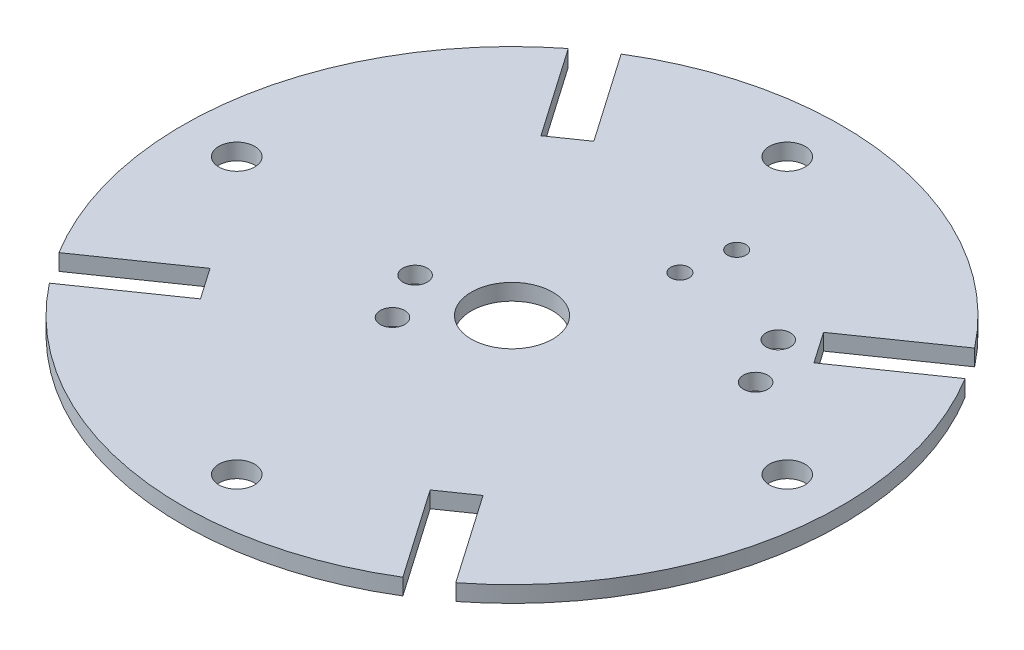
ISO-10303-21;
HEADER;
FILE_DESCRIPTION(('STEP AP214'),'2;1');
FILE_NAME('part.step','',(''),(''),'','','');
FILE_SCHEMA(('AUTOMOTIVE_DESIGN { 1 0 10303 214 1 1 1 1 }'));
ENDSEC;
DATA;
#1=APPLICATION_CONTEXT('core data for automotive mechanical design processes');
#2=APPLICATION_PROTOCOL_DEFINITION('international standard','automotive_design',2000,#1);
#3=PRODUCT_CONTEXT('',#1,'mechanical');
#4=PRODUCT('Part','Part','',(#3));
#5=PRODUCT_RELATED_PRODUCT_CATEGORY('part','',(#4));
#6=PRODUCT_DEFINITION_FORMATION('','',#4);
#7=PRODUCT_DEFINITION_CONTEXT('part definition',#1,'design');
#8=PRODUCT_DEFINITION('design','',#6,#7);
#9=PRODUCT_DEFINITION_SHAPE('','',#8);
#10=(LENGTH_UNIT() NAMED_UNIT(*) SI_UNIT(.MILLI.,.METRE.));
#11=(NAMED_UNIT(*) PLANE_ANGLE_UNIT() SI_UNIT($,.RADIAN.));
#12=(NAMED_UNIT(*) SI_UNIT($,.STERADIAN.) SOLID_ANGLE_UNIT());
#13=UNCERTAINTY_MEASURE_WITH_UNIT(LENGTH_MEASURE(1.E-05),#10,'distance_accuracy_value','');
#14=(GEOMETRIC_REPRESENTATION_CONTEXT(3) GLOBAL_UNCERTAINTY_ASSIGNED_CONTEXT((#13)) GLOBAL_UNIT_ASSIGNED_CONTEXT((#10,
#11,#12)) REPRESENTATION_CONTEXT('',''));
#15=CARTESIAN_POINT('',(0.,0.,0.));
#16=DIRECTION('',(0.,0.,1.));
#17=DIRECTION('',(1.,0.,0.));
#18=AXIS2_PLACEMENT_3D('',#15,#16,#17);
#19=CARTESIAN_POINT('',(0.,1.5,0.));
#20=DIRECTION('',(0.,-1.,0.));
#21=DIRECTION('',(0.,0.,-1.));
#22=AXIS2_PLACEMENT_3D('',#19,#20,#21);
#23=CYLINDRICAL_SURFACE('',#22,60.7);
#24=CARTESIAN_POINT('',(0.,-1.5,0.));
#25=DIRECTION('',(0.,1.,0.));
#26=DIRECTION('',(0.,0.,1.));
#27=AXIS2_PLACEMENT_3D('',#24,#25,#26);
#28=CIRCLE('',#27,60.7);
#29=CARTESIAN_POINT('',(37.4279786936085,-1.5,47.7874084975403));
#30=VERTEX_POINT('',#29);
#31=CARTESIAN_POINT('',(51.7787065197054,-1.5,-31.6773665437363));
#32=VERTEX_POINT('',#31);
#33=EDGE_CURVE('E45',#30,#32,#28,.T.);
#34=ORIENTED_EDGE('',*,*,#33,.T.);
#35=DIRECTION('',(0.,1.,0.));
#36=VECTOR('',#35,1.);
#37=CARTESIAN_POINT('',(51.7787065197054,-1.5,-31.6773665437363));
#38=LINE('',#37,#36);
#39=CARTESIAN_POINT('',(51.7787065197054,1.5,-31.6773665437363));
#40=VERTEX_POINT('',#39);
#41=EDGE_CURVE('E186',#32,#40,#38,.T.);
#42=ORIENTED_EDGE('',*,*,#41,.T.);
#43=CARTESIAN_POINT('',(0.,1.5,0.));
#44=DIRECTION('',(0.,1.,0.));
#45=DIRECTION('',(0.,0.,1.));
#46=AXIS2_PLACEMENT_3D('',#43,#44,#45);
#47=CIRCLE('',#46,60.7);
#48=CARTESIAN_POINT('',(37.4279786936085,1.5,47.7874084975403));
#49=VERTEX_POINT('',#48);
#50=EDGE_CURVE('E11',#49,#40,#47,.T.);
#51=ORIENTED_EDGE('',*,*,#50,.F.);
#52=DIRECTION('',(0.,1.,0.));
#53=VECTOR('',#52,1.);
#54=CARTESIAN_POINT('',(37.4279786936085,-1.5,47.7874084975403));
#55=LINE('',#54,#53);
#56=EDGE_CURVE('E252',#30,#49,#55,.T.);
#57=ORIENTED_EDGE('',*,*,#56,.F.);
#58=EDGE_LOOP('',(#34,#42,#51,#57));
#59=FACE_BOUND('',#58,.T.);
#60=ADVANCED_FACE('F41',(#59),#23,.T.);
#61=CARTESIAN_POINT('',(47.7874084975402,1.5,-37.4279786936087));
#62=VERTEX_POINT('',#61);
#63=CARTESIAN_POINT('',(-31.6773665437361,1.5,-51.7787065197055));
#64=VERTEX_POINT('',#63);
#65=EDGE_CURVE('E50',#62,#64,#47,.T.);
#66=ORIENTED_EDGE('',*,*,#65,.F.);
#67=DIRECTION('',(0.,1.,0.));
#68=VECTOR('',#67,1.);
#69=CARTESIAN_POINT('',(47.7874084975402,-1.5,-37.4279786936087));
#70=LINE('',#69,#68);
#71=CARTESIAN_POINT('',(47.7874084975402,-1.5,-37.4279786936087));
#72=VERTEX_POINT('',#71);
#73=EDGE_CURVE('E162',#72,#62,#70,.T.);
#74=ORIENTED_EDGE('',*,*,#73,.F.);
#75=CARTESIAN_POINT('',(-31.6773665437361,-1.5,-51.7787065197055));
#76=VERTEX_POINT('',#75);
#77=EDGE_CURVE('E330',#72,#76,#28,.T.);
#78=ORIENTED_EDGE('',*,*,#77,.T.);
#79=DIRECTION('',(0.,1.,0.));
#80=VECTOR('',#79,1.);
#81=CARTESIAN_POINT('',(-31.6773665437361,-1.5,-51.7787065197055));
#82=LINE('',#81,#80);
#83=EDGE_CURVE('E211',#76,#64,#82,.T.);
#84=ORIENTED_EDGE('',*,*,#83,.T.);
#85=EDGE_LOOP('',(#66,#74,#78,#84));
#86=FACE_BOUND('',#85,.T.);
#87=ADVANCED_FACE('F339',(#86),#23,.T.);
#88=CARTESIAN_POINT('',(-37.4279786936085,1.5,-47.7874084975403));
#89=VERTEX_POINT('',#88);
#90=CARTESIAN_POINT('',(-51.7787065197051,1.5,31.6773665437366));
#91=VERTEX_POINT('',#90);
#92=EDGE_CURVE('E335',#89,#91,#47,.T.);
#93=ORIENTED_EDGE('',*,*,#92,.F.);
#94=DIRECTION('',(0.,1.,0.));
#95=VECTOR('',#94,1.);
#96=CARTESIAN_POINT('',(-37.4279786936085,-1.5,-47.7874084975403));
#97=LINE('',#96,#95);
#98=CARTESIAN_POINT('',(-37.4279786936085,-1.5,-47.7874084975403));
#99=VERTEX_POINT('',#98);
#100=EDGE_CURVE('E201',#99,#89,#97,.T.);
#101=ORIENTED_EDGE('',*,*,#100,.F.);
#102=CARTESIAN_POINT('',(-51.7787065197051,-1.5,31.6773665437366));
#103=VERTEX_POINT('',#102);
#104=EDGE_CURVE('E324',#99,#103,#28,.T.);
#105=ORIENTED_EDGE('',*,*,#104,.T.);
#106=DIRECTION('',(0.,1.,0.));
#107=VECTOR('',#106,1.);
#108=CARTESIAN_POINT('',(-51.7787065197051,-1.5,31.6773665437366));
#109=LINE('',#108,#107);
#110=EDGE_CURVE('E237',#103,#91,#109,.T.);
#111=ORIENTED_EDGE('',*,*,#110,.T.);
#112=EDGE_LOOP('',(#93,#101,#105,#111));
#113=FACE_BOUND('',#112,.T.);
#114=ADVANCED_FACE('F354',(#113),#23,.T.);
#115=CARTESIAN_POINT('',(-47.7874084975399,1.5,37.427978693609));
#116=VERTEX_POINT('',#115);
#117=CARTESIAN_POINT('',(31.6773665437361,1.5,51.7787065197055));
#118=VERTEX_POINT('',#117);
#119=EDGE_CURVE('E51',#116,#118,#47,.T.);
#120=ORIENTED_EDGE('',*,*,#119,.F.);
#121=DIRECTION('',(0.,1.,0.));
#122=VECTOR('',#121,1.);
#123=CARTESIAN_POINT('',(-47.7874084975399,-1.5,37.427978693609));
#124=LINE('',#123,#122);
#125=CARTESIAN_POINT('',(-47.7874084975399,-1.5,37.427978693609));
#126=VERTEX_POINT('',#125);
#127=EDGE_CURVE('E225',#126,#116,#124,.T.);
#128=ORIENTED_EDGE('',*,*,#127,.F.);
#129=CARTESIAN_POINT('',(31.6773665437361,-1.5,51.7787065197055));
#130=VERTEX_POINT('',#129);
#131=EDGE_CURVE('E321',#126,#130,#28,.T.);
#132=ORIENTED_EDGE('',*,*,#131,.T.);
#133=DIRECTION('',(0.,1.,0.));
#134=VECTOR('',#133,1.);
#135=CARTESIAN_POINT('',(31.6773665437361,-1.5,51.7787065197055));
#136=LINE('',#135,#134);
#137=EDGE_CURVE('E260',#130,#118,#136,.T.);
#138=ORIENTED_EDGE('',*,*,#137,.T.);
#139=EDGE_LOOP('',(#120,#128,#132,#138));
#140=FACE_BOUND('',#139,.T.);
#141=ADVANCED_FACE('F43',(#140),#23,.T.);
#142=CARTESIAN_POINT('',(0.,1.5,0.));
#143=DIRECTION('',(0.,1.,0.));
#144=DIRECTION('',(0.,0.,1.));
#145=AXIS2_PLACEMENT_3D('',#142,#143,#144);
#146=PLANE('',#145);
#147=CARTESIAN_POINT('',(10.2041877460902,1.5,-31.1829208452727));
#148=DIRECTION('',(0.,1.,0.));
#149=DIRECTION('',(0.,0.,1.));
#150=AXIS2_PLACEMENT_3D('',#147,#148,#149);
#151=CIRCLE('',#150,1.69999999999999);
#152=CARTESIAN_POINT('',(10.2041877460902,1.5,-29.4829208452727));
#153=VERTEX_POINT('',#152);
#154=EDGE_CURVE('E716',#153,#153,#151,.T.);
#155=ORIENTED_EDGE('',*,*,#154,.F.);
#156=EDGE_LOOP('',(#155));
#157=FACE_BOUND('',#156,.T.);
#158=CARTESIAN_POINT('',(8.60472966759707,1.5,-22.3261870310981));
#159=DIRECTION('',(0.,1.,0.));
#160=DIRECTION('',(0.,0.,1.));
#161=AXIS2_PLACEMENT_3D('',#158,#159,#160);
#162=CIRCLE('',#161,1.69999999999999);
#163=CARTESIAN_POINT('',(8.60472966759707,1.5,-20.6261870310981));
#164=VERTEX_POINT('',#163);
#165=EDGE_CURVE('E718',#164,#164,#162,.T.);
#166=ORIENTED_EDGE('',*,*,#165,.F.);
#167=EDGE_LOOP('',(#166));
#168=FACE_BOUND('',#167,.T.);
#169=DIRECTION('',(0.821516021410346,0.,-0.570185431737883));
#170=VECTOR('',#169,1.);
#171=CARTESIAN_POINT('',(51.7787065197054,1.5,-31.6773665437363));
#172=LINE('',#171,#170);
#173=CARTESIAN_POINT('',(35.3483860914985,1.5,-20.2736579089786));
#174=VERTEX_POINT('',#173);
#175=EDGE_CURVE('E177',#174,#40,#172,.T.);
#176=ORIENTED_EDGE('',*,*,#175,.F.);
#177=DIRECTION('',(0.570185431737886,0.,0.821516021410344));
#178=VECTOR('',#177,1.);
#179=CARTESIAN_POINT('',(35.3483860914985,1.5,-20.2736579089786));
#180=LINE('',#179,#178);
#181=CARTESIAN_POINT('',(31.3570880693333,1.5,-26.024270058851));
#182=VERTEX_POINT('',#181);
#183=EDGE_CURVE('E170',#182,#174,#180,.T.);
#184=ORIENTED_EDGE('',*,*,#183,.F.);
#185=DIRECTION('',(-0.821516021410345,0.,0.570185431737884));
#186=VECTOR('',#185,1.);
#187=CARTESIAN_POINT('',(31.3570880693333,1.5,-26.024270058851));
#188=LINE('',#187,#186);
#189=EDGE_CURVE('E157',#62,#182,#188,.T.);
#190=ORIENTED_EDGE('',*,*,#189,.F.);
#191=ORIENTED_EDGE('',*,*,#65,.T.);
#192=DIRECTION('',(-0.570185431737881,0.,-0.821516021410348));
#193=VECTOR('',#192,1.);
#194=CARTESIAN_POINT('',(-31.6773665437361,1.5,-51.7787065197055));
#195=LINE('',#194,#193);
#196=CARTESIAN_POINT('',(-20.2736579089785,1.5,-35.3483860914985));
#197=VERTEX_POINT('',#196);
#198=EDGE_CURVE('E209',#197,#64,#195,.T.);
#199=ORIENTED_EDGE('',*,*,#198,.F.);
#200=DIRECTION('',(0.821516021410346,0.,-0.570185431737883));
#201=VECTOR('',#200,1.);
#202=CARTESIAN_POINT('',(-20.2736579089785,1.5,-35.3483860914985));
#203=LINE('',#202,#201);
#204=CARTESIAN_POINT('',(-26.0242700588509,1.5,-31.3570880693334));
#205=VERTEX_POINT('',#204);
#206=EDGE_CURVE('E203',#205,#197,#203,.T.);
#207=ORIENTED_EDGE('',*,*,#206,.F.);
#208=DIRECTION('',(0.570185431737881,0.,0.821516021410347));
#209=VECTOR('',#208,1.);
#210=CARTESIAN_POINT('',(-26.0242700588509,1.5,-31.3570880693334));
#211=LINE('',#210,#209);
#212=EDGE_CURVE('E193',#89,#205,#211,.T.);
#213=ORIENTED_EDGE('',*,*,#212,.F.);
#214=ORIENTED_EDGE('',*,*,#92,.T.);
#215=DIRECTION('',(-0.821516021410342,0.,0.570185431737889));
#216=VECTOR('',#215,1.);
#217=CARTESIAN_POINT('',(-51.7787065197051,1.5,31.6773665437366));
#218=LINE('',#217,#216);
#219=CARTESIAN_POINT('',(-35.3483860914983,1.5,20.2736579089789));
#220=VERTEX_POINT('',#219);
#221=EDGE_CURVE('E235',#220,#91,#218,.T.);
#222=ORIENTED_EDGE('',*,*,#221,.F.);
#223=DIRECTION('',(-0.570185431737891,0.,-0.82151602141034));
#224=VECTOR('',#223,1.);
#225=CARTESIAN_POINT('',(-35.3483860914983,1.5,20.2736579089789));
#226=LINE('',#225,#224);
#227=CARTESIAN_POINT('',(-31.3570880693331,1.5,26.0242700588512));
#228=VERTEX_POINT('',#227);
#229=EDGE_CURVE('E227',#228,#220,#226,.T.);
#230=ORIENTED_EDGE('',*,*,#229,.F.);
#231=DIRECTION('',(0.821516021410341,0.,-0.57018543173789));
#232=VECTOR('',#231,1.);
#233=CARTESIAN_POINT('',(-31.3570880693331,1.5,26.0242700588512));
#234=LINE('',#233,#232);
#235=EDGE_CURVE('E216',#116,#228,#234,.T.);
#236=ORIENTED_EDGE('',*,*,#235,.F.);
#237=ORIENTED_EDGE('',*,*,#119,.T.);
#238=DIRECTION('',(0.570185431737881,0.,0.821516021410348));
#239=VECTOR('',#238,1.);
#240=CARTESIAN_POINT('',(31.6773665437361,1.5,51.7787065197055));
#241=LINE('',#240,#239);
#242=CARTESIAN_POINT('',(20.2736579089785,1.5,35.3483860914985));
#243=VERTEX_POINT('',#242);
#244=EDGE_CURVE('E246',#243,#118,#241,.T.);
#245=ORIENTED_EDGE('',*,*,#244,.F.);
#246=DIRECTION('',(-0.821516021410346,0.,0.570185431737883));
#247=VECTOR('',#246,1.);
#248=CARTESIAN_POINT('',(20.2736579089785,1.5,35.3483860914985));
#249=LINE('',#248,#247);
#250=CARTESIAN_POINT('',(26.0242700588509,1.5,31.3570880693334));
#251=VERTEX_POINT('',#250);
#252=EDGE_CURVE('E255',#251,#243,#249,.T.);
#253=ORIENTED_EDGE('',*,*,#252,.F.);
#254=DIRECTION('',(-0.570185431737881,0.,-0.821516021410347));
#255=VECTOR('',#254,1.);
#256=CARTESIAN_POINT('',(26.0242700588509,1.5,31.3570880693334));
#257=LINE('',#256,#255);
#258=EDGE_CURVE('E192',#49,#251,#257,.T.);
#259=ORIENTED_EDGE('',*,*,#258,.F.);
#260=ORIENTED_EDGE('',*,*,#50,.T.);
#261=EDGE_LOOP('',(#176,#184,#190,#191,#199,#207,#213,#214,#222,#230,#236,#237,#245,#253,#259,#260));
#262=FACE_BOUND('',#261,.T.);
#263=CARTESIAN_POINT('',(-15.3774998533789,1.5,2.46880502659326));
#264=DIRECTION('',(0.,-1.,0.));
#265=DIRECTION('',(0.,0.,-1.));
#266=AXIS2_PLACEMENT_3D('',#263,#264,#265);
#267=CIRCLE('',#266,2.25000000000005);
#268=CARTESIAN_POINT('',(-15.3774998533789,1.5,0.218805026593212));
#269=VERTEX_POINT('',#268);
#270=EDGE_CURVE('E269',#269,#269,#267,.T.);
#271=ORIENTED_EDGE('',*,*,#270,.T.);
#272=EDGE_LOOP('',(#271));
#273=FACE_BOUND('',#272,.T.);
#274=CARTESIAN_POINT('',(-10.7064409135533,1.5,11.3108188458923));
#275=DIRECTION('',(0.,-1.,0.));
#276=DIRECTION('',(0.,0.,-1.));
#277=AXIS2_PLACEMENT_3D('',#274,#275,#276);
#278=CIRCLE('',#277,2.25000000000005);
#279=CARTESIAN_POINT('',(-10.7064409135533,1.5,9.06081884589228));
#280=VERTEX_POINT('',#279);
#281=EDGE_CURVE('E279',#280,#280,#278,.T.);
#282=ORIENTED_EDGE('',*,*,#281,.T.);
#283=EDGE_LOOP('',(#282));
#284=FACE_BOUND('',#283,.T.);
#285=CARTESIAN_POINT('',(28.3904685521513,1.5,-20.6529367255437));
#286=DIRECTION('',(0.,-1.,0.));
#287=DIRECTION('',(0.,0.,-1.));
#288=AXIS2_PLACEMENT_3D('',#285,#286,#287);
#289=CIRCLE('',#288,2.25000000000001);
#290=CARTESIAN_POINT('',(28.3904685521513,1.5,-22.9029367255438));
#291=VERTEX_POINT('',#290);
#292=EDGE_CURVE('E285',#291,#291,#289,.T.);
#293=ORIENTED_EDGE('',*,*,#292,.T.);
#294=EDGE_LOOP('',(#293));
#295=FACE_BOUND('',#294,.T.);
#296=CARTESIAN_POINT('',(33.061527491977,1.5,-11.8109229062447));
#297=DIRECTION('',(0.,-1.,0.));
#298=DIRECTION('',(0.,0.,-1.));
#299=AXIS2_PLACEMENT_3D('',#296,#297,#298);
#300=CIRCLE('',#299,2.25000000000002);
#301=CARTESIAN_POINT('',(33.061527491977,1.5,-14.0609229062447));
#302=VERTEX_POINT('',#301);
#303=EDGE_CURVE('E263',#302,#302,#300,.T.);
#304=ORIENTED_EDGE('',*,*,#303,.T.);
#305=EDGE_LOOP('',(#304));
#306=FACE_BOUND('',#305,.T.);
#307=CARTESIAN_POINT('',(0.,1.5,0.));
#308=DIRECTION('',(0.,1.,0.));
#309=DIRECTION('',(0.,0.,1.));
#310=AXIS2_PLACEMENT_3D('',#307,#308,#309);
#311=CIRCLE('',#310,7.5);
#312=CARTESIAN_POINT('',(0.,1.5,7.5));
#313=VERTEX_POINT('',#312);
#314=EDGE_CURVE('E272',#313,#313,#311,.T.);
#315=ORIENTED_EDGE('',*,*,#314,.F.);
#316=EDGE_LOOP('',(#315));
#317=FACE_BOUND('',#316,.T.);
#318=CARTESIAN_POINT('',(-1.77018103879347E-13,1.5,-50.7));
#319=DIRECTION('',(0.,1.,0.));
#320=DIRECTION('',(1.,0.,0.));
#321=AXIS2_PLACEMENT_3D('',#318,#319,#320);
#322=CIRCLE('',#321,3.3);
#323=CARTESIAN_POINT('',(3.29999999999982,1.5,-50.7));
#324=VERTEX_POINT('',#323);
#325=EDGE_CURVE('E302',#324,#324,#322,.T.);
#326=ORIENTED_EDGE('',*,*,#325,.F.);
#327=EDGE_LOOP('',(#326));
#328=FACE_BOUND('',#327,.T.);
#329=CARTESIAN_POINT('',(-50.7,1.5,0.));
#330=DIRECTION('',(0.,1.,0.));
#331=DIRECTION('',(0.,0.,-1.));
#332=AXIS2_PLACEMENT_3D('',#329,#330,#331);
#333=CIRCLE('',#332,3.3);
#334=CARTESIAN_POINT('',(-50.7,1.5,-3.3));
#335=VERTEX_POINT('',#334);
#336=EDGE_CURVE('E303',#335,#335,#333,.T.);
#337=ORIENTED_EDGE('',*,*,#336,.F.);
#338=EDGE_LOOP('',(#337));
#339=FACE_BOUND('',#338,.T.);
#340=CARTESIAN_POINT('',(5.31054311638041E-13,1.5,50.7));
#341=DIRECTION('',(0.,1.,0.));
#342=DIRECTION('',(-1.,0.,0.));
#343=AXIS2_PLACEMENT_3D('',#340,#341,#342);
#344=CIRCLE('',#343,3.3);
#345=CARTESIAN_POINT('',(-3.29999999999947,1.5,50.7));
#346=VERTEX_POINT('',#345);
#347=EDGE_CURVE('E310',#346,#346,#344,.T.);
#348=ORIENTED_EDGE('',*,*,#347,.F.);
#349=EDGE_LOOP('',(#348));
#350=FACE_BOUND('',#349,.T.);
#351=CARTESIAN_POINT('',(50.7,1.5,0.));
#352=DIRECTION('',(0.,1.,0.));
#353=DIRECTION('',(0.,0.,1.));
#354=AXIS2_PLACEMENT_3D('',#351,#352,#353);
#355=CIRCLE('',#354,3.3);
#356=CARTESIAN_POINT('',(50.7,1.5,3.3));
#357=VERTEX_POINT('',#356);
#358=EDGE_CURVE('E306',#357,#357,#355,.T.);
#359=ORIENTED_EDGE('',*,*,#358,.F.);
#360=EDGE_LOOP('',(#359));
#361=FACE_BOUND('',#360,.T.);
#362=ADVANCED_FACE('F175',(#157,#168,#262,#273,#284,#295,#306,#317,#328,#339,#350,#361),#146,.T.);
#363=CARTESIAN_POINT('',(0.,-1.5,0.));
#364=DIRECTION('',(0.,1.,0.));
#365=DIRECTION('',(0.,0.,1.));
#366=AXIS2_PLACEMENT_3D('',#363,#364,#365);
#367=PLANE('',#366);
#368=CARTESIAN_POINT('',(10.2041877460902,-1.5,-31.1829208452727));
#369=DIRECTION('',(0.,1.,0.));
#370=DIRECTION('',(0.,0.,1.));
#371=AXIS2_PLACEMENT_3D('',#368,#369,#370);
#372=CIRCLE('',#371,1.69999999999999);
#373=CARTESIAN_POINT('',(10.2041877460902,-1.5,-29.4829208452727));
#374=VERTEX_POINT('',#373);
#375=EDGE_CURVE('E713',#374,#374,#372,.T.);
#376=ORIENTED_EDGE('',*,*,#375,.T.);
#377=EDGE_LOOP('',(#376));
#378=FACE_BOUND('',#377,.T.);
#379=CARTESIAN_POINT('',(8.60472966759707,-1.5,-22.3261870310981));
#380=DIRECTION('',(0.,1.,0.));
#381=DIRECTION('',(0.,0.,1.));
#382=AXIS2_PLACEMENT_3D('',#379,#380,#381);
#383=CIRCLE('',#382,1.69999999999999);
#384=CARTESIAN_POINT('',(8.60472966759707,-1.5,-20.6261870310981));
#385=VERTEX_POINT('',#384);
#386=EDGE_CURVE('E219',#385,#385,#383,.T.);
#387=ORIENTED_EDGE('',*,*,#386,.T.);
#388=EDGE_LOOP('',(#387));
#389=FACE_BOUND('',#388,.T.);
#390=CARTESIAN_POINT('',(-15.3774998533789,-1.5,2.46880502659326));
#391=DIRECTION('',(0.,-1.,0.));
#392=DIRECTION('',(0.,0.,-1.));
#393=AXIS2_PLACEMENT_3D('',#390,#391,#392);
#394=CIRCLE('',#393,2.25000000000005);
#395=CARTESIAN_POINT('',(-15.3774998533789,-1.5,0.218805026593212));
#396=VERTEX_POINT('',#395);
#397=EDGE_CURVE('E273',#396,#396,#394,.T.);
#398=ORIENTED_EDGE('',*,*,#397,.F.);
#399=EDGE_LOOP('',(#398));
#400=FACE_BOUND('',#399,.T.);
#401=CARTESIAN_POINT('',(-10.7064409135533,-1.5,11.3108188458923));
#402=DIRECTION('',(0.,-1.,0.));
#403=DIRECTION('',(0.,0.,-1.));
#404=AXIS2_PLACEMENT_3D('',#401,#402,#403);
#405=CIRCLE('',#404,2.25000000000005);
#406=CARTESIAN_POINT('',(-10.7064409135533,-1.5,9.06081884589228));
#407=VERTEX_POINT('',#406);
#408=EDGE_CURVE('E276',#407,#407,#405,.T.);
#409=ORIENTED_EDGE('',*,*,#408,.F.);
#410=EDGE_LOOP('',(#409));
#411=FACE_BOUND('',#410,.T.);
#412=CARTESIAN_POINT('',(28.3904685521513,-1.5,-20.6529367255437));
#413=DIRECTION('',(0.,-1.,0.));
#414=DIRECTION('',(0.,0.,-1.));
#415=AXIS2_PLACEMENT_3D('',#412,#413,#414);
#416=CIRCLE('',#415,2.25000000000001);
#417=CARTESIAN_POINT('',(28.3904685521513,-1.5,-22.9029367255438));
#418=VERTEX_POINT('',#417);
#419=EDGE_CURVE('E282',#418,#418,#416,.T.);
#420=ORIENTED_EDGE('',*,*,#419,.F.);
#421=EDGE_LOOP('',(#420));
#422=FACE_BOUND('',#421,.T.);
#423=CARTESIAN_POINT('',(33.061527491977,-1.5,-11.8109229062447));
#424=DIRECTION('',(0.,-1.,0.));
#425=DIRECTION('',(0.,0.,-1.));
#426=AXIS2_PLACEMENT_3D('',#423,#424,#425);
#427=CIRCLE('',#426,2.25000000000002);
#428=CARTESIAN_POINT('',(33.061527491977,-1.5,-14.0609229062447));
#429=VERTEX_POINT('',#428);
#430=EDGE_CURVE('E288',#429,#429,#427,.T.);
#431=ORIENTED_EDGE('',*,*,#430,.F.);
#432=EDGE_LOOP('',(#431));
#433=FACE_BOUND('',#432,.T.);
#434=CARTESIAN_POINT('',(0.,-1.5,0.));
#435=DIRECTION('',(0.,1.,0.));
#436=DIRECTION('',(0.,0.,1.));
#437=AXIS2_PLACEMENT_3D('',#434,#435,#436);
#438=CIRCLE('',#437,7.5);
#439=CARTESIAN_POINT('',(0.,-1.5,7.5));
#440=VERTEX_POINT('',#439);
#441=EDGE_CURVE('E293',#440,#440,#438,.T.);
#442=ORIENTED_EDGE('',*,*,#441,.T.);
#443=EDGE_LOOP('',(#442));
#444=FACE_BOUND('',#443,.T.);
#445=CARTESIAN_POINT('',(-1.77018103879347E-13,-1.5,-50.7));
#446=DIRECTION('',(0.,1.,0.));
#447=DIRECTION('',(1.,0.,0.));
#448=AXIS2_PLACEMENT_3D('',#445,#446,#447);
#449=CIRCLE('',#448,3.3);
#450=CARTESIAN_POINT('',(3.29999999999982,-1.5,-50.7));
#451=VERTEX_POINT('',#450);
#452=EDGE_CURVE('E299',#451,#451,#449,.T.);
#453=ORIENTED_EDGE('',*,*,#452,.T.);
#454=EDGE_LOOP('',(#453));
#455=FACE_BOUND('',#454,.T.);
#456=CARTESIAN_POINT('',(-50.7,-1.5,0.));
#457=DIRECTION('',(0.,1.,0.));
#458=DIRECTION('',(0.,0.,-1.));
#459=AXIS2_PLACEMENT_3D('',#456,#457,#458);
#460=CIRCLE('',#459,3.3);
#461=CARTESIAN_POINT('',(-50.7,-1.5,-3.3));
#462=VERTEX_POINT('',#461);
#463=EDGE_CURVE('E307',#462,#462,#460,.T.);
#464=ORIENTED_EDGE('',*,*,#463,.T.);
#465=EDGE_LOOP('',(#464));
#466=FACE_BOUND('',#465,.T.);
#467=CARTESIAN_POINT('',(5.31054311638041E-13,-1.5,50.7));
#468=DIRECTION('',(0.,1.,0.));
#469=DIRECTION('',(-1.,0.,0.));
#470=AXIS2_PLACEMENT_3D('',#467,#468,#469);
#471=CIRCLE('',#470,3.3);
#472=CARTESIAN_POINT('',(-3.29999999999947,-1.5,50.7));
#473=VERTEX_POINT('',#472);
#474=EDGE_CURVE('E296',#473,#473,#471,.T.);
#475=ORIENTED_EDGE('',*,*,#474,.T.);
#476=EDGE_LOOP('',(#475));
#477=FACE_BOUND('',#476,.T.);
#478=CARTESIAN_POINT('',(50.7,-1.5,0.));
#479=DIRECTION('',(0.,1.,0.));
#480=DIRECTION('',(0.,0.,1.));
#481=AXIS2_PLACEMENT_3D('',#478,#479,#480);
#482=CIRCLE('',#481,3.3);
#483=CARTESIAN_POINT('',(50.7,-1.5,3.3));
#484=VERTEX_POINT('',#483);
#485=EDGE_CURVE('E319',#484,#484,#482,.T.);
#486=ORIENTED_EDGE('',*,*,#485,.T.);
#487=EDGE_LOOP('',(#486));
#488=FACE_BOUND('',#487,.T.);
#489=DIRECTION('',(0.570185431737886,0.,0.821516021410344));
#490=VECTOR('',#489,1.);
#491=CARTESIAN_POINT('',(35.3483860914985,-1.5,-20.2736579089786));
#492=LINE('',#491,#490);
#493=CARTESIAN_POINT('',(31.3570880693333,-1.5,-26.024270058851));
#494=VERTEX_POINT('',#493);
#495=CARTESIAN_POINT('',(35.3483860914985,-1.5,-20.2736579089786));
#496=VERTEX_POINT('',#495);
#497=EDGE_CURVE('E58',#494,#496,#492,.T.);
#498=ORIENTED_EDGE('',*,*,#497,.T.);
#499=DIRECTION('',(0.821516021410346,0.,-0.570185431737883));
#500=VECTOR('',#499,1.);
#501=CARTESIAN_POINT('',(51.7787065197054,-1.5,-31.6773665437363));
#502=LINE('',#501,#500);
#503=EDGE_CURVE('E189',#496,#32,#502,.T.);
#504=ORIENTED_EDGE('',*,*,#503,.T.);
#505=ORIENTED_EDGE('',*,*,#33,.F.);
#506=DIRECTION('',(-0.570185431737881,0.,-0.821516021410347));
#507=VECTOR('',#506,1.);
#508=CARTESIAN_POINT('',(26.0242700588509,-1.5,31.3570880693334));
#509=LINE('',#508,#507);
#510=CARTESIAN_POINT('',(26.0242700588509,-1.5,31.3570880693334));
#511=VERTEX_POINT('',#510);
#512=EDGE_CURVE('E242',#30,#511,#509,.T.);
#513=ORIENTED_EDGE('',*,*,#512,.T.);
#514=DIRECTION('',(-0.821516021410346,0.,0.570185431737883));
#515=VECTOR('',#514,1.);
#516=CARTESIAN_POINT('',(20.2736579089785,-1.5,35.3483860914985));
#517=LINE('',#516,#515);
#518=CARTESIAN_POINT('',(20.2736579089785,-1.5,35.3483860914985));
#519=VERTEX_POINT('',#518);
#520=EDGE_CURVE('E245',#511,#519,#517,.T.);
#521=ORIENTED_EDGE('',*,*,#520,.T.);
#522=DIRECTION('',(0.570185431737881,0.,0.821516021410348));
#523=VECTOR('',#522,1.);
#524=CARTESIAN_POINT('',(31.6773665437361,-1.5,51.7787065197055));
#525=LINE('',#524,#523);
#526=EDGE_CURVE('E249',#519,#130,#525,.T.);
#527=ORIENTED_EDGE('',*,*,#526,.T.);
#528=ORIENTED_EDGE('',*,*,#131,.F.);
#529=DIRECTION('',(0.821516021410341,0.,-0.57018543173789));
#530=VECTOR('',#529,1.);
#531=CARTESIAN_POINT('',(-31.3570880693331,-1.5,26.0242700588512));
#532=LINE('',#531,#530);
#533=CARTESIAN_POINT('',(-31.3570880693331,-1.5,26.0242700588512));
#534=VERTEX_POINT('',#533);
#535=EDGE_CURVE('E222',#126,#534,#532,.T.);
#536=ORIENTED_EDGE('',*,*,#535,.T.);
#537=DIRECTION('',(-0.570185431737891,0.,-0.82151602141034));
#538=VECTOR('',#537,1.);
#539=CARTESIAN_POINT('',(-35.3483860914983,-1.5,20.2736579089789));
#540=LINE('',#539,#538);
#541=CARTESIAN_POINT('',(-35.3483860914983,-1.5,20.2736579089789));
#542=VERTEX_POINT('',#541);
#543=EDGE_CURVE('E232',#534,#542,#540,.T.);
#544=ORIENTED_EDGE('',*,*,#543,.T.);
#545=DIRECTION('',(-0.821516021410342,0.,0.570185431737889));
#546=VECTOR('',#545,1.);
#547=CARTESIAN_POINT('',(-51.7787065197051,-1.5,31.6773665437366));
#548=LINE('',#547,#546);
#549=EDGE_CURVE('E196',#542,#103,#548,.T.);
#550=ORIENTED_EDGE('',*,*,#549,.T.);
#551=ORIENTED_EDGE('',*,*,#104,.F.);
#552=DIRECTION('',(0.570185431737881,0.,0.821516021410347));
#553=VECTOR('',#552,1.);
#554=CARTESIAN_POINT('',(-26.0242700588509,-1.5,-31.3570880693334));
#555=LINE('',#554,#553);
#556=CARTESIAN_POINT('',(-26.0242700588509,-1.5,-31.3570880693334));
#557=VERTEX_POINT('',#556);
#558=EDGE_CURVE('E198',#99,#557,#555,.T.);
#559=ORIENTED_EDGE('',*,*,#558,.T.);
#560=DIRECTION('',(0.821516021410346,0.,-0.570185431737883));
#561=VECTOR('',#560,1.);
#562=CARTESIAN_POINT('',(-20.2736579089785,-1.5,-35.3483860914985));
#563=LINE('',#562,#561);
#564=CARTESIAN_POINT('',(-20.2736579089785,-1.5,-35.3483860914985));
#565=VERTEX_POINT('',#564);
#566=EDGE_CURVE('E66',#557,#565,#563,.T.);
#567=ORIENTED_EDGE('',*,*,#566,.T.);
#568=DIRECTION('',(-0.570185431737881,0.,-0.821516021410348));
#569=VECTOR('',#568,1.);
#570=CARTESIAN_POINT('',(-31.6773665437361,-1.5,-51.7787065197055));
#571=LINE('',#570,#569);
#572=EDGE_CURVE('E167',#565,#76,#571,.T.);
#573=ORIENTED_EDGE('',*,*,#572,.T.);
#574=ORIENTED_EDGE('',*,*,#77,.F.);
#575=DIRECTION('',(-0.821516021410345,0.,0.570185431737884));
#576=VECTOR('',#575,1.);
#577=CARTESIAN_POINT('',(31.3570880693333,-1.5,-26.024270058851));
#578=LINE('',#577,#576);
#579=EDGE_CURVE('E172',#72,#494,#578,.T.);
#580=ORIENTED_EDGE('',*,*,#579,.T.);
#581=EDGE_LOOP('',(#498,#504,#505,#513,#521,#527,#528,#536,#544,#550,#551,#559,#567,#573,#574,#580));
#582=FACE_BOUND('',#581,.T.);
#583=ADVANCED_FACE('F341',(#378,#389,#400,#411,#422,#433,#444,#455,#466,#477,#488,#582),#367,.F.);
#584=CARTESIAN_POINT('',(50.7,1.5,0.));
#585=DIRECTION('',(0.,1.,0.));
#586=DIRECTION('',(0.,0.,1.));
#587=AXIS2_PLACEMENT_3D('',#584,#585,#586);
#588=CYLINDRICAL_SURFACE('',#587,3.3);
#589=ORIENTED_EDGE('',*,*,#485,.F.);
#590=EDGE_LOOP('',(#589));
#591=FACE_BOUND('',#590,.T.);
#592=ORIENTED_EDGE('',*,*,#358,.T.);
#593=EDGE_LOOP('',(#592));
#594=FACE_BOUND('',#593,.T.);
#595=ADVANCED_FACE('F531',(#591,#594),#588,.F.);
#596=CARTESIAN_POINT('',(5.31054311638041E-13,1.5,50.7));
#597=DIRECTION('',(0.,1.,0.));
#598=DIRECTION('',(-1.,0.,0.));
#599=AXIS2_PLACEMENT_3D('',#596,#597,#598);
#600=CYLINDRICAL_SURFACE('',#599,3.3);
#601=ORIENTED_EDGE('',*,*,#474,.F.);
#602=EDGE_LOOP('',(#601));
#603=FACE_BOUND('',#602,.T.);
#604=ORIENTED_EDGE('',*,*,#347,.T.);
#605=EDGE_LOOP('',(#604));
#606=FACE_BOUND('',#605,.T.);
#607=ADVANCED_FACE('F520',(#603,#606),#600,.F.);
#608=CARTESIAN_POINT('',(-50.7,1.5,0.));
#609=DIRECTION('',(0.,1.,0.));
#610=DIRECTION('',(0.,0.,-1.));
#611=AXIS2_PLACEMENT_3D('',#608,#609,#610);
#612=CYLINDRICAL_SURFACE('',#611,3.3);
#613=ORIENTED_EDGE('',*,*,#463,.F.);
#614=EDGE_LOOP('',(#613));
#615=FACE_BOUND('',#614,.T.);
#616=ORIENTED_EDGE('',*,*,#336,.T.);
#617=EDGE_LOOP('',(#616));
#618=FACE_BOUND('',#617,.T.);
#619=ADVANCED_FACE('F509',(#615,#618),#612,.F.);
#620=CARTESIAN_POINT('',(-1.77018103879347E-13,1.5,-50.7));
#621=DIRECTION('',(0.,1.,0.));
#622=DIRECTION('',(1.,0.,0.));
#623=AXIS2_PLACEMENT_3D('',#620,#621,#622);
#624=CYLINDRICAL_SURFACE('',#623,3.3);
#625=ORIENTED_EDGE('',*,*,#452,.F.);
#626=EDGE_LOOP('',(#625));
#627=FACE_BOUND('',#626,.T.);
#628=ORIENTED_EDGE('',*,*,#325,.T.);
#629=EDGE_LOOP('',(#628));
#630=FACE_BOUND('',#629,.T.);
#631=ADVANCED_FACE('F498',(#627,#630),#624,.F.);
#632=CARTESIAN_POINT('',(0.,-1.5,0.));
#633=DIRECTION('',(0.,1.,0.));
#634=DIRECTION('',(0.,0.,1.));
#635=AXIS2_PLACEMENT_3D('',#632,#633,#634);
#636=CYLINDRICAL_SURFACE('',#635,7.5);
#637=ORIENTED_EDGE('',*,*,#441,.F.);
#638=EDGE_LOOP('',(#637));
#639=FACE_BOUND('',#638,.T.);
#640=ORIENTED_EDGE('',*,*,#314,.T.);
#641=EDGE_LOOP('',(#640));
#642=FACE_BOUND('',#641,.T.);
#643=ADVANCED_FACE('F487',(#639,#642),#636,.F.);
#644=CARTESIAN_POINT('',(33.061527491977,1.5,-11.8109229062447));
#645=DIRECTION('',(0.,-1.,0.));
#646=DIRECTION('',(0.,0.,-1.));
#647=AXIS2_PLACEMENT_3D('',#644,#645,#646);
#648=CYLINDRICAL_SURFACE('',#647,2.25000000000002);
#649=ORIENTED_EDGE('',*,*,#303,.F.);
#650=EDGE_LOOP('',(#649));
#651=FACE_BOUND('',#650,.T.);
#652=ORIENTED_EDGE('',*,*,#430,.T.);
#653=EDGE_LOOP('',(#652));
#654=FACE_BOUND('',#653,.T.);
#655=ADVANCED_FACE('F476',(#651,#654),#648,.F.);
#656=CARTESIAN_POINT('',(28.3904685521513,1.5,-20.6529367255437));
#657=DIRECTION('',(0.,-1.,0.));
#658=DIRECTION('',(0.,0.,-1.));
#659=AXIS2_PLACEMENT_3D('',#656,#657,#658);
#660=CYLINDRICAL_SURFACE('',#659,2.25000000000001);
#661=ORIENTED_EDGE('',*,*,#292,.F.);
#662=EDGE_LOOP('',(#661));
#663=FACE_BOUND('',#662,.T.);
#664=ORIENTED_EDGE('',*,*,#419,.T.);
#665=EDGE_LOOP('',(#664));
#666=FACE_BOUND('',#665,.T.);
#667=ADVANCED_FACE('F465',(#663,#666),#660,.F.);
#668=CARTESIAN_POINT('',(-10.7064409135533,1.5,11.3108188458923));
#669=DIRECTION('',(0.,-1.,0.));
#670=DIRECTION('',(0.,0.,-1.));
#671=AXIS2_PLACEMENT_3D('',#668,#669,#670);
#672=CYLINDRICAL_SURFACE('',#671,2.25000000000005);
#673=ORIENTED_EDGE('',*,*,#281,.F.);
#674=EDGE_LOOP('',(#673));
#675=FACE_BOUND('',#674,.T.);
#676=ORIENTED_EDGE('',*,*,#408,.T.);
#677=EDGE_LOOP('',(#676));
#678=FACE_BOUND('',#677,.T.);
#679=ADVANCED_FACE('F454',(#675,#678),#672,.F.);
#680=CARTESIAN_POINT('',(-15.3774998533789,1.5,2.46880502659326));
#681=DIRECTION('',(0.,-1.,0.));
#682=DIRECTION('',(0.,0.,-1.));
#683=AXIS2_PLACEMENT_3D('',#680,#681,#682);
#684=CYLINDRICAL_SURFACE('',#683,2.25000000000005);
#685=ORIENTED_EDGE('',*,*,#270,.F.);
#686=EDGE_LOOP('',(#685));
#687=FACE_BOUND('',#686,.T.);
#688=ORIENTED_EDGE('',*,*,#397,.T.);
#689=EDGE_LOOP('',(#688));
#690=FACE_BOUND('',#689,.T.);
#691=ADVANCED_FACE('F444',(#687,#690),#684,.F.);
#692=CARTESIAN_POINT('',(31.6773665437361,-1.5,51.7787065197055));
#693=DIRECTION('',(-0.821516021410348,0.,0.570185431737881));
#694=DIRECTION('',(0.570185431737881,0.,0.821516021410348));
#695=AXIS2_PLACEMENT_3D('',#692,#693,#694);
#696=PLANE('',#695);
#697=ORIENTED_EDGE('',*,*,#244,.T.);
#698=ORIENTED_EDGE('',*,*,#137,.F.);
#699=ORIENTED_EDGE('',*,*,#526,.F.);
#700=DIRECTION('',(0.,1.,0.));
#701=VECTOR('',#700,1.);
#702=CARTESIAN_POINT('',(20.2736579089785,-1.5,35.3483860914985));
#703=LINE('',#702,#701);
#704=EDGE_CURVE('E264',#519,#243,#703,.T.);
#705=ORIENTED_EDGE('',*,*,#704,.T.);
#706=EDGE_LOOP('',(#697,#698,#699,#705));
#707=FACE_BOUND('',#706,.T.);
#708=ADVANCED_FACE('F369',(#707),#696,.F.);
#709=CARTESIAN_POINT('',(20.2736579089785,-1.5,35.3483860914985));
#710=DIRECTION('',(-0.570185431737883,0.,-0.821516021410346));
#711=DIRECTION('',(-0.821516021410346,0.,0.570185431737883));
#712=AXIS2_PLACEMENT_3D('',#709,#710,#711);
#713=PLANE('',#712);
#714=ORIENTED_EDGE('',*,*,#252,.T.);
#715=ORIENTED_EDGE('',*,*,#704,.F.);
#716=ORIENTED_EDGE('',*,*,#520,.F.);
#717=DIRECTION('',(0.,1.,0.));
#718=VECTOR('',#717,1.);
#719=CARTESIAN_POINT('',(26.0242700588509,-1.5,31.3570880693334));
#720=LINE('',#719,#718);
#721=EDGE_CURVE('E266',#511,#251,#720,.T.);
#722=ORIENTED_EDGE('',*,*,#721,.T.);
#723=EDGE_LOOP('',(#714,#715,#716,#722));
#724=FACE_BOUND('',#723,.T.);
#725=ADVANCED_FACE('F372',(#724),#713,.F.);
#726=CARTESIAN_POINT('',(26.0242700588509,-1.5,31.3570880693334));
#727=DIRECTION('',(0.821516021410347,0.,-0.570185431737881));
#728=DIRECTION('',(-0.570185431737881,0.,-0.821516021410347));
#729=AXIS2_PLACEMENT_3D('',#726,#727,#728);
#730=PLANE('',#729);
#731=ORIENTED_EDGE('',*,*,#258,.T.);
#732=ORIENTED_EDGE('',*,*,#721,.F.);
#733=ORIENTED_EDGE('',*,*,#512,.F.);
#734=ORIENTED_EDGE('',*,*,#56,.T.);
#735=EDGE_LOOP('',(#731,#732,#733,#734));
#736=FACE_BOUND('',#735,.T.);
#737=ADVANCED_FACE('F374',(#736),#730,.F.);
#738=CARTESIAN_POINT('',(-51.7787065197051,-1.5,31.6773665437366));
#739=DIRECTION('',(-0.570185431737889,0.,-0.821516021410342));
#740=DIRECTION('',(-0.821516021410342,0.,0.570185431737889));
#741=AXIS2_PLACEMENT_3D('',#738,#739,#740);
#742=PLANE('',#741);
#743=ORIENTED_EDGE('',*,*,#221,.T.);
#744=ORIENTED_EDGE('',*,*,#110,.F.);
#745=ORIENTED_EDGE('',*,*,#549,.F.);
#746=DIRECTION('',(0.,1.,0.));
#747=VECTOR('',#746,1.);
#748=CARTESIAN_POINT('',(-35.3483860914983,-1.5,20.2736579089789));
#749=LINE('',#748,#747);
#750=EDGE_CURVE('E229',#542,#220,#749,.T.);
#751=ORIENTED_EDGE('',*,*,#750,.T.);
#752=EDGE_LOOP('',(#743,#744,#745,#751));
#753=FACE_BOUND('',#752,.T.);
#754=ADVANCED_FACE('F358',(#753),#742,.F.);
#755=CARTESIAN_POINT('',(-35.3483860914983,-1.5,20.2736579089789));
#756=DIRECTION('',(0.82151602141034,0.,-0.570185431737891));
#757=DIRECTION('',(-0.570185431737891,0.,-0.82151602141034));
#758=AXIS2_PLACEMENT_3D('',#755,#756,#757);
#759=PLANE('',#758);
#760=ORIENTED_EDGE('',*,*,#229,.T.);
#761=ORIENTED_EDGE('',*,*,#750,.F.);
#762=ORIENTED_EDGE('',*,*,#543,.F.);
#763=DIRECTION('',(0.,1.,0.));
#764=VECTOR('',#763,1.);
#765=CARTESIAN_POINT('',(-31.3570880693331,-1.5,26.0242700588512));
#766=LINE('',#765,#764);
#767=EDGE_CURVE('E218',#534,#228,#766,.T.);
#768=ORIENTED_EDGE('',*,*,#767,.T.);
#769=EDGE_LOOP('',(#760,#761,#762,#768));
#770=FACE_BOUND('',#769,.T.);
#771=ADVANCED_FACE('F361',(#770),#759,.F.);
#772=CARTESIAN_POINT('',(-31.3570880693331,-1.5,26.0242700588512));
#773=DIRECTION('',(0.57018543173789,0.,0.821516021410341));
#774=DIRECTION('',(0.821516021410341,0.,-0.57018543173789));
#775=AXIS2_PLACEMENT_3D('',#772,#773,#774);
#776=PLANE('',#775);
#777=ORIENTED_EDGE('',*,*,#235,.T.);
#778=ORIENTED_EDGE('',*,*,#767,.F.);
#779=ORIENTED_EDGE('',*,*,#535,.F.);
#780=ORIENTED_EDGE('',*,*,#127,.T.);
#781=EDGE_LOOP('',(#777,#778,#779,#780));
#782=FACE_BOUND('',#781,.T.);
#783=ADVANCED_FACE('F363',(#782),#776,.F.);
#784=CARTESIAN_POINT('',(-31.6773665437361,-1.5,-51.7787065197055));
#785=DIRECTION('',(0.821516021410348,0.,-0.570185431737881));
#786=DIRECTION('',(-0.570185431737881,0.,-0.821516021410348));
#787=AXIS2_PLACEMENT_3D('',#784,#785,#786);
#788=PLANE('',#787);
#789=ORIENTED_EDGE('',*,*,#198,.T.);
#790=ORIENTED_EDGE('',*,*,#83,.F.);
#791=ORIENTED_EDGE('',*,*,#572,.F.);
#792=DIRECTION('',(0.,1.,0.));
#793=VECTOR('',#792,1.);
#794=CARTESIAN_POINT('',(-20.2736579089785,-1.5,-35.3483860914985));
#795=LINE('',#794,#793);
#796=EDGE_CURVE('E205',#565,#197,#795,.T.);
#797=ORIENTED_EDGE('',*,*,#796,.T.);
#798=EDGE_LOOP('',(#789,#790,#791,#797));
#799=FACE_BOUND('',#798,.T.);
#800=ADVANCED_FACE('F344',(#799),#788,.F.);
#801=CARTESIAN_POINT('',(-20.2736579089785,-1.5,-35.3483860914985));
#802=DIRECTION('',(0.570185431737883,0.,0.821516021410346));
#803=DIRECTION('',(0.821516021410346,0.,-0.570185431737883));
#804=AXIS2_PLACEMENT_3D('',#801,#802,#803);
#805=PLANE('',#804);
#806=ORIENTED_EDGE('',*,*,#206,.T.);
#807=ORIENTED_EDGE('',*,*,#796,.F.);
#808=ORIENTED_EDGE('',*,*,#566,.F.);
#809=DIRECTION('',(0.,1.,0.));
#810=VECTOR('',#809,1.);
#811=CARTESIAN_POINT('',(-26.0242700588509,-1.5,-31.3570880693334));
#812=LINE('',#811,#810);
#813=EDGE_CURVE('E195',#557,#205,#812,.T.);
#814=ORIENTED_EDGE('',*,*,#813,.T.);
#815=EDGE_LOOP('',(#806,#807,#808,#814));
#816=FACE_BOUND('',#815,.T.);
#817=ADVANCED_FACE('F389',(#816),#805,.F.);
#818=CARTESIAN_POINT('',(-26.0242700588509,-1.5,-31.3570880693334));
#819=DIRECTION('',(-0.821516021410347,0.,0.570185431737881));
#820=DIRECTION('',(0.570185431737881,0.,0.821516021410347));
#821=AXIS2_PLACEMENT_3D('',#818,#819,#820);
#822=PLANE('',#821);
#823=ORIENTED_EDGE('',*,*,#212,.T.);
#824=ORIENTED_EDGE('',*,*,#813,.F.);
#825=ORIENTED_EDGE('',*,*,#558,.F.);
#826=ORIENTED_EDGE('',*,*,#100,.T.);
#827=EDGE_LOOP('',(#823,#824,#825,#826));
#828=FACE_BOUND('',#827,.T.);
#829=ADVANCED_FACE('F382',(#828),#822,.F.);
#830=CARTESIAN_POINT('',(51.7787065197054,-1.5,-31.6773665437363));
#831=DIRECTION('',(0.570185431737883,0.,0.821516021410346));
#832=DIRECTION('',(0.821516021410346,0.,-0.570185431737884));
#833=AXIS2_PLACEMENT_3D('',#830,#831,#832);
#834=PLANE('',#833);
#835=ORIENTED_EDGE('',*,*,#175,.T.);
#836=ORIENTED_EDGE('',*,*,#41,.F.);
#837=ORIENTED_EDGE('',*,*,#503,.F.);
#838=DIRECTION('',(0.,1.,0.));
#839=VECTOR('',#838,1.);
#840=CARTESIAN_POINT('',(35.3483860914985,-1.5,-20.2736579089786));
#841=LINE('',#840,#839);
#842=EDGE_CURVE('E178',#496,#174,#841,.T.);
#843=ORIENTED_EDGE('',*,*,#842,.T.);
#844=EDGE_LOOP('',(#835,#836,#837,#843));
#845=FACE_BOUND('',#844,.T.);
#846=ADVANCED_FACE('F380',(#845),#834,.F.);
#847=CARTESIAN_POINT('',(35.3483860914985,-1.5,-20.2736579089786));
#848=DIRECTION('',(-0.821516021410344,0.,0.570185431737886));
#849=DIRECTION('',(0.570185431737886,0.,0.821516021410344));
#850=AXIS2_PLACEMENT_3D('',#847,#848,#849);
#851=PLANE('',#850);
#852=ORIENTED_EDGE('',*,*,#183,.T.);
#853=ORIENTED_EDGE('',*,*,#842,.F.);
#854=ORIENTED_EDGE('',*,*,#497,.F.);
#855=DIRECTION('',(0.,1.,0.));
#856=VECTOR('',#855,1.);
#857=CARTESIAN_POINT('',(31.3570880693333,-1.5,-26.024270058851));
#858=LINE('',#857,#856);
#859=EDGE_CURVE('E159',#494,#182,#858,.T.);
#860=ORIENTED_EDGE('',*,*,#859,.T.);
#861=EDGE_LOOP('',(#852,#853,#854,#860));
#862=FACE_BOUND('',#861,.T.);
#863=ADVANCED_FACE('F169',(#862),#851,.F.);
#864=CARTESIAN_POINT('',(31.3570880693333,-1.5,-26.024270058851));
#865=DIRECTION('',(-0.570185431737884,0.,-0.821516021410345));
#866=DIRECTION('',(-0.821516021410345,0.,0.570185431737884));
#867=AXIS2_PLACEMENT_3D('',#864,#865,#866);
#868=PLANE('',#867);
#869=ORIENTED_EDGE('',*,*,#189,.T.);
#870=ORIENTED_EDGE('',*,*,#859,.F.);
#871=ORIENTED_EDGE('',*,*,#579,.F.);
#872=ORIENTED_EDGE('',*,*,#73,.T.);
#873=EDGE_LOOP('',(#869,#870,#871,#872));
#874=FACE_BOUND('',#873,.T.);
#875=ADVANCED_FACE('F158',(#874),#868,.F.);
#876=CARTESIAN_POINT('',(8.60472966759707,1.5,-22.3261870310981));
#877=DIRECTION('',(0.,1.,0.));
#878=DIRECTION('',(0.,0.,1.));
#879=AXIS2_PLACEMENT_3D('',#876,#877,#878);
#880=CYLINDRICAL_SURFACE('',#879,1.69999999999999);
#881=ORIENTED_EDGE('',*,*,#386,.F.);
#882=EDGE_LOOP('',(#881));
#883=FACE_BOUND('',#882,.T.);
#884=ORIENTED_EDGE('',*,*,#165,.T.);
#885=EDGE_LOOP('',(#884));
#886=FACE_BOUND('',#885,.T.);
#887=ADVANCED_FACE('F587',(#883,#886),#880,.F.);
#888=CARTESIAN_POINT('',(10.2041877460902,1.5,-31.1829208452727));
#889=DIRECTION('',(0.,1.,0.));
#890=DIRECTION('',(0.,0.,1.));
#891=AXIS2_PLACEMENT_3D('',#888,#889,#890);
#892=CYLINDRICAL_SURFACE('',#891,1.69999999999999);
#893=ORIENTED_EDGE('',*,*,#375,.F.);
#894=EDGE_LOOP('',(#893));
#895=FACE_BOUND('',#894,.T.);
#896=ORIENTED_EDGE('',*,*,#154,.T.);
#897=EDGE_LOOP('',(#896));
#898=FACE_BOUND('',#897,.T.);
#899=ADVANCED_FACE('F592',(#895,#898),#892,.F.);
#900=CLOSED_SHELL('',(#60,#87,#114,#141,#362,#583,#595,#607,#619,#631,#643,#655,#667,#679,#691,
#708,#725,#737,#754,#771,#783,#800,#817,#829,#846,#863,#875,#887,#899));
#901=MANIFOLD_SOLID_BREP('B2',#900);
#902=ADVANCED_BREP_SHAPE_REPRESENTATION('',(#18,#901),#14);
#903=SHAPE_DEFINITION_REPRESENTATION(#9,#902);
ENDSEC;
END-ISO-10303-21;
